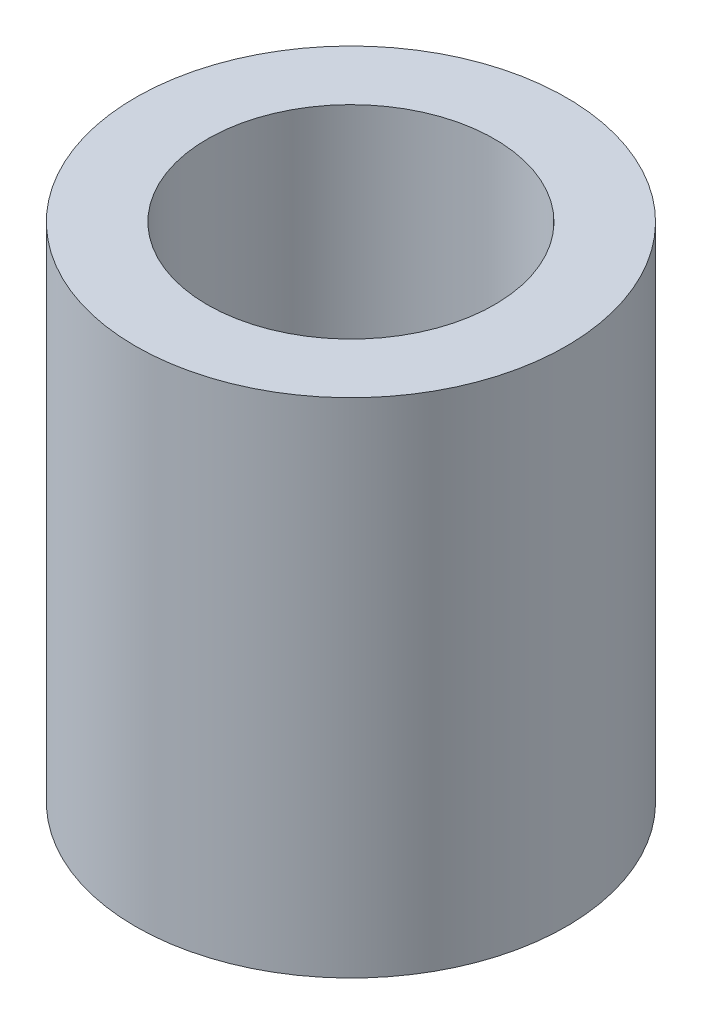
ISO-10303-21;
HEADER;
FILE_DESCRIPTION(('STEP AP214'),'2;1');
FILE_NAME('part.step','',(''),(''),'','','');
FILE_SCHEMA(('AUTOMOTIVE_DESIGN { 1 0 10303 214 1 1 1 1 }'));
ENDSEC;
DATA;
#1=APPLICATION_CONTEXT('core data for automotive mechanical design processes');
#2=APPLICATION_PROTOCOL_DEFINITION('international standard','automotive_design',2000,#1);
#3=PRODUCT_CONTEXT('',#1,'mechanical');
#4=PRODUCT('Part','Part','',(#3));
#5=PRODUCT_RELATED_PRODUCT_CATEGORY('part','',(#4));
#6=PRODUCT_DEFINITION_FORMATION('','',#4);
#7=PRODUCT_DEFINITION_CONTEXT('part definition',#1,'design');
#8=PRODUCT_DEFINITION('design','',#6,#7);
#9=PRODUCT_DEFINITION_SHAPE('','',#8);
#10=(LENGTH_UNIT() NAMED_UNIT(*) SI_UNIT(.MILLI.,.METRE.));
#11=(NAMED_UNIT(*) PLANE_ANGLE_UNIT() SI_UNIT($,.RADIAN.));
#12=(NAMED_UNIT(*) SI_UNIT($,.STERADIAN.) SOLID_ANGLE_UNIT());
#13=UNCERTAINTY_MEASURE_WITH_UNIT(LENGTH_MEASURE(1.E-05),#10,'distance_accuracy_value','');
#14=(GEOMETRIC_REPRESENTATION_CONTEXT(3) GLOBAL_UNCERTAINTY_ASSIGNED_CONTEXT((#13)) GLOBAL_UNIT_ASSIGNED_CONTEXT((#10,
#11,#12)) REPRESENTATION_CONTEXT('',''));
#15=CARTESIAN_POINT('',(0.,0.,0.));
#16=DIRECTION('',(0.,0.,1.));
#17=DIRECTION('',(1.,0.,0.));
#18=AXIS2_PLACEMENT_3D('',#15,#16,#17);
#19=CARTESIAN_POINT('',(0.,7.,0.));
#20=DIRECTION('',(0.,1.,0.));
#21=DIRECTION('',(0.,0.,1.));
#22=AXIS2_PLACEMENT_3D('',#19,#20,#21);
#23=PLANE('',#22);
#24=CARTESIAN_POINT('',(0.,7.,0.));
#25=DIRECTION('',(0.,1.,0.));
#26=DIRECTION('',(0.,0.,1.));
#27=AXIS2_PLACEMENT_3D('',#24,#25,#26);
#28=CIRCLE('',#27,3.);
#29=CARTESIAN_POINT('',(0.,7.,3.));
#30=VERTEX_POINT('',#29);
#31=EDGE_CURVE('E10',#30,#30,#28,.T.);
#32=ORIENTED_EDGE('',*,*,#31,.T.);
#33=EDGE_LOOP('',(#32));
#34=FACE_BOUND('',#33,.T.);
#35=CARTESIAN_POINT('',(0.,7.,0.));
#36=DIRECTION('',(0.,1.,0.));
#37=DIRECTION('',(0.,0.,1.));
#38=AXIS2_PLACEMENT_3D('',#35,#36,#37);
#39=CIRCLE('',#38,2.);
#40=CARTESIAN_POINT('',(0.,7.,2.));
#41=VERTEX_POINT('',#40);
#42=EDGE_CURVE('E50',#41,#41,#39,.T.);
#43=ORIENTED_EDGE('',*,*,#42,.F.);
#44=EDGE_LOOP('',(#43));
#45=FACE_BOUND('',#44,.T.);
#46=ADVANCED_FACE('F37',(#34,#45),#23,.T.);
#47=CARTESIAN_POINT('',(0.,0.,0.));
#48=DIRECTION('',(0.,1.,0.));
#49=DIRECTION('',(0.,0.,1.));
#50=AXIS2_PLACEMENT_3D('',#47,#48,#49);
#51=PLANE('',#50);
#52=CARTESIAN_POINT('',(0.,0.,0.));
#53=DIRECTION('',(0.,1.,0.));
#54=DIRECTION('',(0.,0.,1.));
#55=AXIS2_PLACEMENT_3D('',#52,#53,#54);
#56=CIRCLE('',#55,3.);
#57=CARTESIAN_POINT('',(0.,0.,3.));
#58=VERTEX_POINT('',#57);
#59=EDGE_CURVE('E41',#58,#58,#56,.T.);
#60=ORIENTED_EDGE('',*,*,#59,.F.);
#61=EDGE_LOOP('',(#60));
#62=FACE_BOUND('',#61,.T.);
#63=CARTESIAN_POINT('',(0.,0.,0.));
#64=DIRECTION('',(0.,1.,0.));
#65=DIRECTION('',(0.,0.,1.));
#66=AXIS2_PLACEMENT_3D('',#63,#64,#65);
#67=CIRCLE('',#66,2.);
#68=CARTESIAN_POINT('',(0.,0.,2.));
#69=VERTEX_POINT('',#68);
#70=EDGE_CURVE('E52',#69,#69,#67,.T.);
#71=ORIENTED_EDGE('',*,*,#70,.T.);
#72=EDGE_LOOP('',(#71));
#73=FACE_BOUND('',#72,.T.);
#74=ADVANCED_FACE('F64',(#62,#73),#51,.F.);
#75=CARTESIAN_POINT('',(0.,7.,0.));
#76=DIRECTION('',(0.,-1.,0.));
#77=DIRECTION('',(0.,0.,-1.));
#78=AXIS2_PLACEMENT_3D('',#75,#76,#77);
#79=CYLINDRICAL_SURFACE('',#78,3.);
#80=ORIENTED_EDGE('',*,*,#31,.F.);
#81=EDGE_LOOP('',(#80));
#82=FACE_BOUND('',#81,.T.);
#83=ORIENTED_EDGE('',*,*,#59,.T.);
#84=EDGE_LOOP('',(#83));
#85=FACE_BOUND('',#84,.T.);
#86=ADVANCED_FACE('F39',(#82,#85),#79,.T.);
#87=CARTESIAN_POINT('',(0.,7.,0.));
#88=DIRECTION('',(0.,-1.,0.));
#89=DIRECTION('',(0.,0.,-1.));
#90=AXIS2_PLACEMENT_3D('',#87,#88,#89);
#91=CYLINDRICAL_SURFACE('',#90,2.);
#92=ORIENTED_EDGE('',*,*,#42,.T.);
#93=EDGE_LOOP('',(#92));
#94=FACE_BOUND('',#93,.T.);
#95=ORIENTED_EDGE('',*,*,#70,.F.);
#96=EDGE_LOOP('',(#95));
#97=FACE_BOUND('',#96,.T.);
#98=ADVANCED_FACE('F60',(#94,#97),#91,.F.);
#99=CLOSED_SHELL('',(#46,#74,#86,#98));
#100=MANIFOLD_SOLID_BREP('B2',#99);
#101=ADVANCED_BREP_SHAPE_REPRESENTATION('',(#18,#100),#14);
#102=SHAPE_DEFINITION_REPRESENTATION(#9,#101);
ENDSEC;
END-ISO-10303-21;
